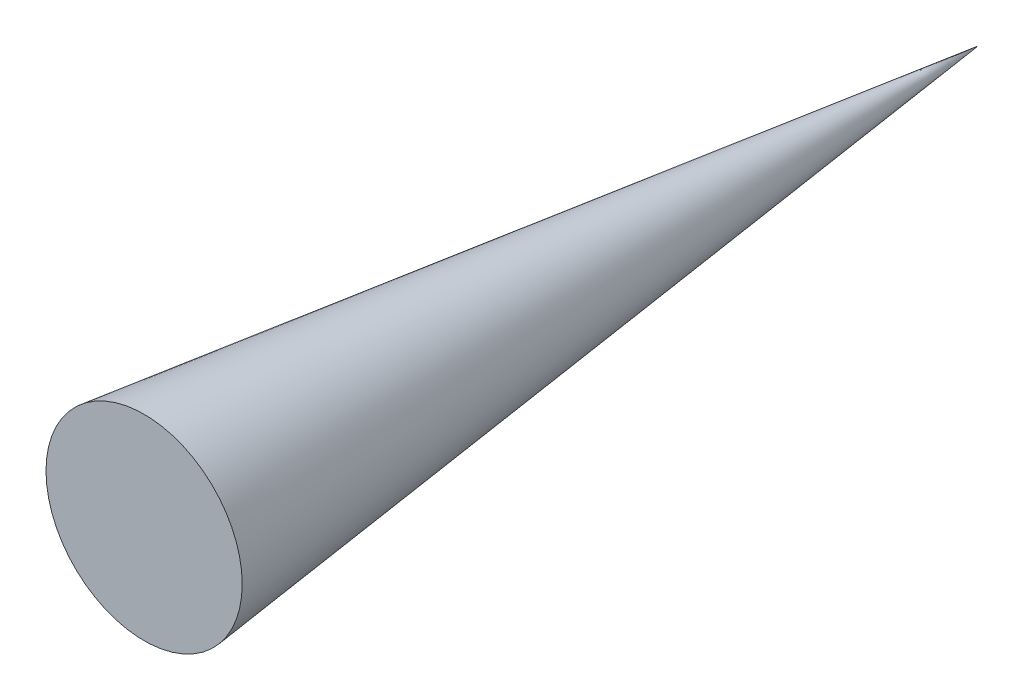
ISO-10303-21;
HEADER;
FILE_DESCRIPTION(('STEP AP214'),'2;1');
FILE_NAME('part.step','',(''),(''),'','','');
FILE_SCHEMA(('AUTOMOTIVE_DESIGN { 1 0 10303 214 1 1 1 1 }'));
ENDSEC;
DATA;
#1=APPLICATION_CONTEXT('core data for automotive mechanical design processes');
#2=APPLICATION_PROTOCOL_DEFINITION('international standard','automotive_design',2000,#1);
#3=PRODUCT_CONTEXT('',#1,'mechanical');
#4=PRODUCT('Part','Part','',(#3));
#5=PRODUCT_RELATED_PRODUCT_CATEGORY('part','',(#4));
#6=PRODUCT_DEFINITION_FORMATION('','',#4);
#7=PRODUCT_DEFINITION_CONTEXT('part definition',#1,'design');
#8=PRODUCT_DEFINITION('design','',#6,#7);
#9=PRODUCT_DEFINITION_SHAPE('','',#8);
#10=(LENGTH_UNIT() NAMED_UNIT(*) SI_UNIT(.MILLI.,.METRE.));
#11=(NAMED_UNIT(*) PLANE_ANGLE_UNIT() SI_UNIT($,.RADIAN.));
#12=(NAMED_UNIT(*) SI_UNIT($,.STERADIAN.) SOLID_ANGLE_UNIT());
#13=UNCERTAINTY_MEASURE_WITH_UNIT(LENGTH_MEASURE(1.E-05),#10,'distance_accuracy_value','');
#14=(GEOMETRIC_REPRESENTATION_CONTEXT(3) GLOBAL_UNCERTAINTY_ASSIGNED_CONTEXT((#13)) GLOBAL_UNIT_ASSIGNED_CONTEXT((#10,
#11,#12)) REPRESENTATION_CONTEXT('',''));
#15=CARTESIAN_POINT('',(0.,0.,0.));
#16=DIRECTION('',(0.,0.,1.));
#17=DIRECTION('',(1.,0.,0.));
#18=AXIS2_PLACEMENT_3D('',#15,#16,#17);
#19=CARTESIAN_POINT('',(-14.166894013122,0.,-20.2168758205167));
#20=DIRECTION('',(0.,0.,1.));
#21=DIRECTION('',(1.,0.,0.));
#22=AXIS2_PLACEMENT_3D('',#19,#20,#21);
#23=CONICAL_SURFACE('',#22,0.,0.117108744566864);
#24=CARTESIAN_POINT('',(-14.166894013122,0.,-3.21687582051674));
#25=DIRECTION('',(0.,0.,-1.));
#26=DIRECTION('',(-1.,0.,0.));
#27=AXIS2_PLACEMENT_3D('',#24,#25,#26);
#28=CIRCLE('',#27,2.);
#29=CARTESIAN_POINT('',(-16.166894013122,0.,-3.21687582051674));
#30=VERTEX_POINT('',#29);
#31=EDGE_CURVE('E11',#30,#30,#28,.T.);
#32=ORIENTED_EDGE('',*,*,#31,.T.);
#33=EDGE_LOOP('',(#32));
#34=FACE_BOUND('',#33,.T.);
#35=CARTESIAN_POINT('',(-14.166894013122,0.,-20.2168758205167));
#36=VERTEX_POINT('',#35);
#37=VERTEX_LOOP('',#36);
#38=FACE_BOUND('',#37,.T.);
#39=ADVANCED_FACE('F33',(#34,#38),#23,.T.);
#40=CARTESIAN_POINT('',(-14.166894013122,0.,-3.21687582051674));
#41=DIRECTION('',(0.,0.,1.));
#42=DIRECTION('',(1.,0.,0.));
#43=AXIS2_PLACEMENT_3D('',#40,#41,#42);
#44=PLANE('',#43);
#45=ORIENTED_EDGE('',*,*,#31,.F.);
#46=EDGE_LOOP('',(#45));
#47=FACE_BOUND('',#46,.T.);
#48=ADVANCED_FACE('F41',(#47),#44,.T.);
#49=CLOSED_SHELL('',(#39,#48));
#50=MANIFOLD_SOLID_BREP('B2',#49);
#51=ADVANCED_BREP_SHAPE_REPRESENTATION('',(#18,#50),#14);
#52=SHAPE_DEFINITION_REPRESENTATION(#9,#51);
ENDSEC;
END-ISO-10303-21;
